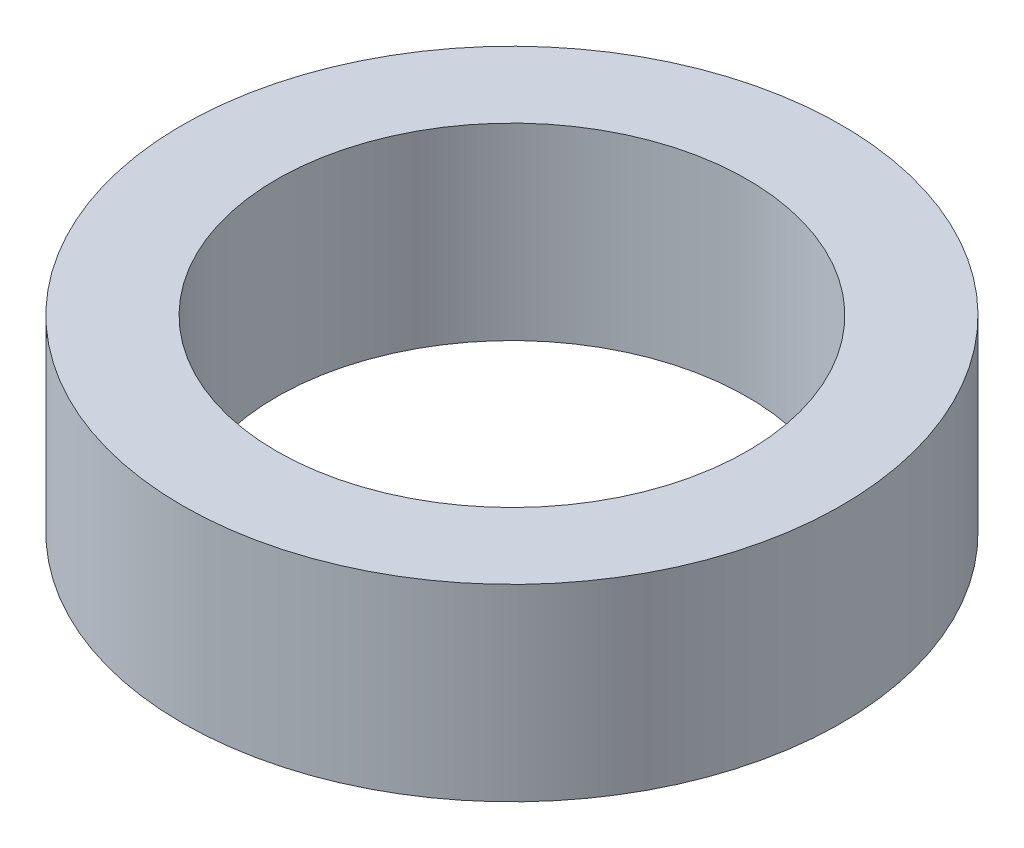
ISO-10303-21;
HEADER;
FILE_DESCRIPTION(('STEP AP214'),'2;1');
FILE_NAME('part.step','',(''),(''),'','','');
FILE_SCHEMA(('AUTOMOTIVE_DESIGN { 1 0 10303 214 1 1 1 1 }'));
ENDSEC;
DATA;
#1=APPLICATION_CONTEXT('core data for automotive mechanical design processes');
#2=APPLICATION_PROTOCOL_DEFINITION('international standard','automotive_design',2000,#1);
#3=PRODUCT_CONTEXT('',#1,'mechanical');
#4=PRODUCT('Part','Part','',(#3));
#5=PRODUCT_RELATED_PRODUCT_CATEGORY('part','',(#4));
#6=PRODUCT_DEFINITION_FORMATION('','',#4);
#7=PRODUCT_DEFINITION_CONTEXT('part definition',#1,'design');
#8=PRODUCT_DEFINITION('design','',#6,#7);
#9=PRODUCT_DEFINITION_SHAPE('','',#8);
#10=(LENGTH_UNIT() NAMED_UNIT(*) SI_UNIT(.MILLI.,.METRE.));
#11=(NAMED_UNIT(*) PLANE_ANGLE_UNIT() SI_UNIT($,.RADIAN.));
#12=(NAMED_UNIT(*) SI_UNIT($,.STERADIAN.) SOLID_ANGLE_UNIT());
#13=UNCERTAINTY_MEASURE_WITH_UNIT(LENGTH_MEASURE(1.E-05),#10,'distance_accuracy_value','');
#14=(GEOMETRIC_REPRESENTATION_CONTEXT(3) GLOBAL_UNCERTAINTY_ASSIGNED_CONTEXT((#13)) GLOBAL_UNIT_ASSIGNED_CONTEXT((#10,
#11,#12)) REPRESENTATION_CONTEXT('',''));
#15=CARTESIAN_POINT('',(0.,0.,0.));
#16=DIRECTION('',(0.,0.,1.));
#17=DIRECTION('',(1.,0.,0.));
#18=AXIS2_PLACEMENT_3D('',#15,#16,#17);
#19=CARTESIAN_POINT('',(0.,8.,0.));
#20=DIRECTION('',(0.,1.,0.));
#21=DIRECTION('',(0.,0.,1.));
#22=AXIS2_PLACEMENT_3D('',#19,#20,#21);
#23=PLANE('',#22);
#24=CARTESIAN_POINT('',(0.,8.,0.));
#25=DIRECTION('',(0.,1.,0.));
#26=DIRECTION('',(0.,0.,1.));
#27=AXIS2_PLACEMENT_3D('',#24,#25,#26);
#28=CIRCLE('',#27,14.);
#29=CARTESIAN_POINT('',(0.,8.,14.));
#30=VERTEX_POINT('',#29);
#31=EDGE_CURVE('E10',#30,#30,#28,.T.);
#32=ORIENTED_EDGE('',*,*,#31,.T.);
#33=EDGE_LOOP('',(#32));
#34=FACE_BOUND('',#33,.T.);
#35=CARTESIAN_POINT('',(0.,8.,0.));
#36=DIRECTION('',(0.,1.,0.));
#37=DIRECTION('',(0.,0.,1.));
#38=AXIS2_PLACEMENT_3D('',#35,#36,#37);
#39=CIRCLE('',#38,10.);
#40=CARTESIAN_POINT('',(0.,8.,10.));
#41=VERTEX_POINT('',#40);
#42=EDGE_CURVE('E42',#41,#41,#39,.T.);
#43=ORIENTED_EDGE('',*,*,#42,.F.);
#44=EDGE_LOOP('',(#43));
#45=FACE_BOUND('',#44,.T.);
#46=ADVANCED_FACE('F31',(#34,#45),#23,.T.);
#47=CARTESIAN_POINT('',(0.,0.,0.));
#48=DIRECTION('',(0.,1.,0.));
#49=DIRECTION('',(0.,0.,1.));
#50=AXIS2_PLACEMENT_3D('',#47,#48,#49);
#51=PLANE('',#50);
#52=CARTESIAN_POINT('',(0.,0.,0.));
#53=DIRECTION('',(0.,1.,0.));
#54=DIRECTION('',(0.,0.,1.));
#55=AXIS2_PLACEMENT_3D('',#52,#53,#54);
#56=CIRCLE('',#55,14.);
#57=CARTESIAN_POINT('',(0.,0.,14.));
#58=VERTEX_POINT('',#57);
#59=EDGE_CURVE('E35',#58,#58,#56,.T.);
#60=ORIENTED_EDGE('',*,*,#59,.F.);
#61=EDGE_LOOP('',(#60));
#62=FACE_BOUND('',#61,.T.);
#63=CARTESIAN_POINT('',(0.,0.,0.));
#64=DIRECTION('',(0.,1.,0.));
#65=DIRECTION('',(0.,0.,1.));
#66=AXIS2_PLACEMENT_3D('',#63,#64,#65);
#67=CIRCLE('',#66,10.);
#68=CARTESIAN_POINT('',(0.,0.,10.));
#69=VERTEX_POINT('',#68);
#70=EDGE_CURVE('E44',#69,#69,#67,.T.);
#71=ORIENTED_EDGE('',*,*,#70,.T.);
#72=EDGE_LOOP('',(#71));
#73=FACE_BOUND('',#72,.T.);
#74=ADVANCED_FACE('F54',(#62,#73),#51,.F.);
#75=CARTESIAN_POINT('',(0.,8.,0.));
#76=DIRECTION('',(0.,-1.,0.));
#77=DIRECTION('',(0.,0.,-1.));
#78=AXIS2_PLACEMENT_3D('',#75,#76,#77);
#79=CYLINDRICAL_SURFACE('',#78,14.);
#80=ORIENTED_EDGE('',*,*,#31,.F.);
#81=EDGE_LOOP('',(#80));
#82=FACE_BOUND('',#81,.T.);
#83=ORIENTED_EDGE('',*,*,#59,.T.);
#84=EDGE_LOOP('',(#83));
#85=FACE_BOUND('',#84,.T.);
#86=ADVANCED_FACE('F33',(#82,#85),#79,.T.);
#87=CARTESIAN_POINT('',(0.,8.,0.));
#88=DIRECTION('',(0.,-1.,0.));
#89=DIRECTION('',(0.,0.,-1.));
#90=AXIS2_PLACEMENT_3D('',#87,#88,#89);
#91=CYLINDRICAL_SURFACE('',#90,10.);
#92=ORIENTED_EDGE('',*,*,#42,.T.);
#93=EDGE_LOOP('',(#92));
#94=FACE_BOUND('',#93,.T.);
#95=ORIENTED_EDGE('',*,*,#70,.F.);
#96=EDGE_LOOP('',(#95));
#97=FACE_BOUND('',#96,.T.);
#98=ADVANCED_FACE('F50',(#94,#97),#91,.F.);
#99=CLOSED_SHELL('',(#46,#74,#86,#98));
#100=MANIFOLD_SOLID_BREP('B2',#99);
#101=ADVANCED_BREP_SHAPE_REPRESENTATION('',(#18,#100),#14);
#102=SHAPE_DEFINITION_REPRESENTATION(#9,#101);
ENDSEC;
END-ISO-10303-21;
